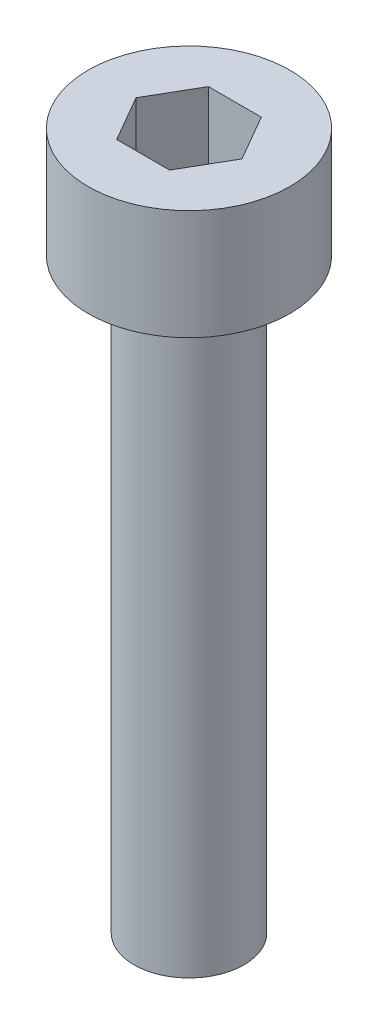
ISO-10303-21;
HEADER;
FILE_DESCRIPTION(('STEP AP214'),'2;1');
FILE_NAME('part.step','',(''),(''),'','','');
FILE_SCHEMA(('AUTOMOTIVE_DESIGN { 1 0 10303 214 1 1 1 1 }'));
ENDSEC;
DATA;
#1=APPLICATION_CONTEXT('core data for automotive mechanical design processes');
#2=APPLICATION_PROTOCOL_DEFINITION('international standard','automotive_design',2000,#1);
#3=PRODUCT_CONTEXT('',#1,'mechanical');
#4=PRODUCT('Part','Part','',(#3));
#5=PRODUCT_RELATED_PRODUCT_CATEGORY('part','',(#4));
#6=PRODUCT_DEFINITION_FORMATION('','',#4);
#7=PRODUCT_DEFINITION_CONTEXT('part definition',#1,'design');
#8=PRODUCT_DEFINITION('design','',#6,#7);
#9=PRODUCT_DEFINITION_SHAPE('','',#8);
#10=(LENGTH_UNIT() NAMED_UNIT(*) SI_UNIT(.MILLI.,.METRE.));
#11=(NAMED_UNIT(*) PLANE_ANGLE_UNIT() SI_UNIT($,.RADIAN.));
#12=(NAMED_UNIT(*) SI_UNIT($,.STERADIAN.) SOLID_ANGLE_UNIT());
#13=UNCERTAINTY_MEASURE_WITH_UNIT(LENGTH_MEASURE(1.E-05),#10,'distance_accuracy_value','');
#14=(GEOMETRIC_REPRESENTATION_CONTEXT(3) GLOBAL_UNCERTAINTY_ASSIGNED_CONTEXT((#13)) GLOBAL_UNIT_ASSIGNED_CONTEXT((#10,
#11,#12)) REPRESENTATION_CONTEXT('',''));
#15=CARTESIAN_POINT('',(0.,0.,0.));
#16=DIRECTION('',(0.,0.,1.));
#17=DIRECTION('',(1.,0.,0.));
#18=AXIS2_PLACEMENT_3D('',#15,#16,#17);
#19=CARTESIAN_POINT('',(0.,1.,0.));
#20=DIRECTION('',(0.,-1.,0.));
#21=DIRECTION('',(0.,0.,-1.));
#22=AXIS2_PLACEMENT_3D('',#19,#20,#21);
#23=PLANE('',#22);
#24=DIRECTION('',(0.50000000000019,0.,0.866025403784329));
#25=VECTOR('',#24,1.);
#26=CARTESIAN_POINT('',(0.7216875,1.,-1.249999417187));
#27=LINE('',#26,#25);
#28=CARTESIAN_POINT('',(0.7216875,1.,-1.249999417187));
#29=VERTEX_POINT('',#28);
#30=CARTESIAN_POINT('',(1.443375,1.,0.));
#31=VERTEX_POINT('',#30);
#32=EDGE_CURVE('E9',#29,#31,#27,.T.);
#33=ORIENTED_EDGE('',*,*,#32,.F.);
#34=DIRECTION('',(1.,0.,0.));
#35=VECTOR('',#34,1.);
#36=CARTESIAN_POINT('',(-0.7216875,1.,-1.249999417187));
#37=LINE('',#36,#35);
#38=CARTESIAN_POINT('',(-0.7216875,1.,-1.249999417187));
#39=VERTEX_POINT('',#38);
#40=EDGE_CURVE('E44',#39,#29,#37,.T.);
#41=ORIENTED_EDGE('',*,*,#40,.F.);
#42=DIRECTION('',(0.50000000000019,0.,-0.866025403784329));
#43=VECTOR('',#42,1.);
#44=CARTESIAN_POINT('',(-1.443375,1.,0.));
#45=LINE('',#44,#43);
#46=CARTESIAN_POINT('',(-1.443375,1.,0.));
#47=VERTEX_POINT('',#46);
#48=EDGE_CURVE('E125',#47,#39,#45,.T.);
#49=ORIENTED_EDGE('',*,*,#48,.F.);
#50=DIRECTION('',(-0.50000000000019,0.,-0.866025403784329));
#51=VECTOR('',#50,1.);
#52=CARTESIAN_POINT('',(-0.7216875,1.,1.249999417187));
#53=LINE('',#52,#51);
#54=CARTESIAN_POINT('',(-0.7216875,1.,1.249999417187));
#55=VERTEX_POINT('',#54);
#56=EDGE_CURVE('E88',#55,#47,#53,.T.);
#57=ORIENTED_EDGE('',*,*,#56,.F.);
#58=DIRECTION('',(-1.,0.,0.));
#59=VECTOR('',#58,1.);
#60=CARTESIAN_POINT('',(0.7216875,1.,1.249999417187));
#61=LINE('',#60,#59);
#62=CARTESIAN_POINT('',(0.7216875,1.,1.249999417187));
#63=VERTEX_POINT('',#62);
#64=EDGE_CURVE('E83',#63,#55,#61,.T.);
#65=ORIENTED_EDGE('',*,*,#64,.F.);
#66=DIRECTION('',(-0.50000000000019,0.,0.866025403784329));
#67=VECTOR('',#66,1.);
#68=CARTESIAN_POINT('',(1.443375,1.,0.));
#69=LINE('',#68,#67);
#70=EDGE_CURVE('E86',#31,#63,#69,.T.);
#71=ORIENTED_EDGE('',*,*,#70,.F.);
#72=EDGE_LOOP('',(#33,#41,#49,#57,#65,#71));
#73=FACE_BOUND('',#72,.T.);
#74=ADVANCED_FACE('F15',(#73),#23,.F.);
#75=CARTESIAN_POINT('',(0.,-16.,0.));
#76=DIRECTION('',(0.,-1.,0.));
#77=DIRECTION('',(0.,0.,-1.));
#78=AXIS2_PLACEMENT_3D('',#75,#76,#77);
#79=PLANE('',#78);
#80=CARTESIAN_POINT('',(0.,-16.,0.));
#81=DIRECTION('',(0.,-1.,0.));
#82=DIRECTION('',(1.,0.,0.));
#83=AXIS2_PLACEMENT_3D('',#80,#81,#82);
#84=CIRCLE('',#83,1.5);
#85=CARTESIAN_POINT('',(1.5,-16.,0.));
#86=VERTEX_POINT('',#85);
#87=EDGE_CURVE('E109',#86,#86,#84,.T.);
#88=ORIENTED_EDGE('',*,*,#87,.T.);
#89=EDGE_LOOP('',(#88));
#90=FACE_BOUND('',#89,.T.);
#91=ADVANCED_FACE('F232',(#90),#79,.T.);
#92=CARTESIAN_POINT('',(0.7216875,1.,-1.249999417187));
#93=DIRECTION('',(0.866025403784329,0.,-0.50000000000019));
#94=DIRECTION('',(0.,-1.,0.));
#95=AXIS2_PLACEMENT_3D('',#92,#93,#94);
#96=PLANE('',#95);
#97=ORIENTED_EDGE('',*,*,#32,.T.);
#98=DIRECTION('',(0.,1.,0.));
#99=VECTOR('',#98,1.);
#100=CARTESIAN_POINT('',(1.443375,1.,0.));
#101=LINE('',#100,#99);
#102=CARTESIAN_POINT('',(1.443375,3.,0.));
#103=VERTEX_POINT('',#102);
#104=EDGE_CURVE('E94',#31,#103,#101,.T.);
#105=ORIENTED_EDGE('',*,*,#104,.T.);
#106=DIRECTION('',(0.50000000000019,0.,0.866025403784329));
#107=VECTOR('',#106,1.);
#108=CARTESIAN_POINT('',(0.7216875,3.,-1.249999417187));
#109=LINE('',#108,#107);
#110=CARTESIAN_POINT('',(0.7216875,3.,-1.249999417187));
#111=VERTEX_POINT('',#110);
#112=EDGE_CURVE('E144',#111,#103,#109,.T.);
#113=ORIENTED_EDGE('',*,*,#112,.F.);
#114=DIRECTION('',(0.,1.,0.));
#115=VECTOR('',#114,1.);
#116=CARTESIAN_POINT('',(0.7216875,1.,-1.249999417187));
#117=LINE('',#116,#115);
#118=EDGE_CURVE('E24',#29,#111,#117,.T.);
#119=ORIENTED_EDGE('',*,*,#118,.F.);
#120=EDGE_LOOP('',(#97,#105,#113,#119));
#121=FACE_BOUND('',#120,.T.);
#122=ADVANCED_FACE('F17',(#121),#96,.F.);
#123=CARTESIAN_POINT('',(-0.7216875,1.,-1.249999417187));
#124=DIRECTION('',(0.,0.,-1.));
#125=DIRECTION('',(-1.,0.,0.));
#126=AXIS2_PLACEMENT_3D('',#123,#124,#125);
#127=PLANE('',#126);
#128=ORIENTED_EDGE('',*,*,#40,.T.);
#129=ORIENTED_EDGE('',*,*,#118,.T.);
#130=DIRECTION('',(1.,0.,0.));
#131=VECTOR('',#130,1.);
#132=CARTESIAN_POINT('',(-0.7216875,3.,-1.249999417187));
#133=LINE('',#132,#131);
#134=CARTESIAN_POINT('',(-0.7216875,3.,-1.249999417187));
#135=VERTEX_POINT('',#134);
#136=EDGE_CURVE('E140',#135,#111,#133,.T.);
#137=ORIENTED_EDGE('',*,*,#136,.F.);
#138=DIRECTION('',(0.,1.,0.));
#139=VECTOR('',#138,1.);
#140=CARTESIAN_POINT('',(-0.7216875,1.,-1.249999417187));
#141=LINE('',#140,#139);
#142=EDGE_CURVE('E129',#39,#135,#141,.T.);
#143=ORIENTED_EDGE('',*,*,#142,.F.);
#144=EDGE_LOOP('',(#128,#129,#137,#143));
#145=FACE_BOUND('',#144,.T.);
#146=ADVANCED_FACE('F138',(#145),#127,.F.);
#147=CARTESIAN_POINT('',(-1.443375,1.,0.));
#148=DIRECTION('',(-0.866025403784329,0.,-0.50000000000019));
#149=DIRECTION('',(-0.50000000000019,0.,0.866025403784329));
#150=AXIS2_PLACEMENT_3D('',#147,#148,#149);
#151=PLANE('',#150);
#152=ORIENTED_EDGE('',*,*,#48,.T.);
#153=ORIENTED_EDGE('',*,*,#142,.T.);
#154=DIRECTION('',(0.50000000000019,0.,-0.866025403784329));
#155=VECTOR('',#154,1.);
#156=CARTESIAN_POINT('',(-1.443375,3.,0.));
#157=LINE('',#156,#155);
#158=CARTESIAN_POINT('',(-1.443375,3.,0.));
#159=VERTEX_POINT('',#158);
#160=EDGE_CURVE('E153',#159,#135,#157,.T.);
#161=ORIENTED_EDGE('',*,*,#160,.F.);
#162=DIRECTION('',(0.,1.,0.));
#163=VECTOR('',#162,1.);
#164=CARTESIAN_POINT('',(-1.443375,1.,0.));
#165=LINE('',#164,#163);
#166=EDGE_CURVE('E121',#47,#159,#165,.T.);
#167=ORIENTED_EDGE('',*,*,#166,.F.);
#168=EDGE_LOOP('',(#152,#153,#161,#167));
#169=FACE_BOUND('',#168,.T.);
#170=ADVANCED_FACE('F245',(#169),#151,.F.);
#171=CARTESIAN_POINT('',(-0.7216875,1.,1.249999417187));
#172=DIRECTION('',(-0.866025403784329,0.,0.50000000000019));
#173=DIRECTION('',(0.,1.,0.));
#174=AXIS2_PLACEMENT_3D('',#171,#172,#173);
#175=PLANE('',#174);
#176=ORIENTED_EDGE('',*,*,#56,.T.);
#177=ORIENTED_EDGE('',*,*,#166,.T.);
#178=DIRECTION('',(-0.50000000000019,0.,-0.866025403784329));
#179=VECTOR('',#178,1.);
#180=CARTESIAN_POINT('',(-0.7216875,3.,1.249999417187));
#181=LINE('',#180,#179);
#182=CARTESIAN_POINT('',(-0.7216875,3.,1.249999417187));
#183=VERTEX_POINT('',#182);
#184=EDGE_CURVE('E160',#183,#159,#181,.T.);
#185=ORIENTED_EDGE('',*,*,#184,.F.);
#186=DIRECTION('',(0.,1.,0.));
#187=VECTOR('',#186,1.);
#188=CARTESIAN_POINT('',(-0.7216875,1.,1.249999417187));
#189=LINE('',#188,#187);
#190=EDGE_CURVE('E93',#55,#183,#189,.T.);
#191=ORIENTED_EDGE('',*,*,#190,.F.);
#192=EDGE_LOOP('',(#176,#177,#185,#191));
#193=FACE_BOUND('',#192,.T.);
#194=ADVANCED_FACE('F201',(#193),#175,.F.);
#195=CARTESIAN_POINT('',(0.7216875,1.,1.249999417187));
#196=DIRECTION('',(0.,0.,1.));
#197=DIRECTION('',(1.,0.,0.));
#198=AXIS2_PLACEMENT_3D('',#195,#196,#197);
#199=PLANE('',#198);
#200=ORIENTED_EDGE('',*,*,#64,.T.);
#201=ORIENTED_EDGE('',*,*,#190,.T.);
#202=DIRECTION('',(-1.,0.,0.));
#203=VECTOR('',#202,1.);
#204=CARTESIAN_POINT('',(0.7216875,3.,1.249999417187));
#205=LINE('',#204,#203);
#206=CARTESIAN_POINT('',(0.7216875,3.,1.249999417187));
#207=VERTEX_POINT('',#206);
#208=EDGE_CURVE('E100',#207,#183,#205,.T.);
#209=ORIENTED_EDGE('',*,*,#208,.F.);
#210=DIRECTION('',(0.,1.,0.));
#211=VECTOR('',#210,1.);
#212=CARTESIAN_POINT('',(0.7216875,1.,1.249999417187));
#213=LINE('',#212,#211);
#214=EDGE_CURVE('E97',#63,#207,#213,.T.);
#215=ORIENTED_EDGE('',*,*,#214,.F.);
#216=EDGE_LOOP('',(#200,#201,#209,#215));
#217=FACE_BOUND('',#216,.T.);
#218=ADVANCED_FACE('F98',(#217),#199,.F.);
#219=CARTESIAN_POINT('',(1.443375,1.,0.));
#220=DIRECTION('',(0.866025403784329,0.,0.50000000000019));
#221=DIRECTION('',(0.,-1.,0.));
#222=AXIS2_PLACEMENT_3D('',#219,#220,#221);
#223=PLANE('',#222);
#224=ORIENTED_EDGE('',*,*,#70,.T.);
#225=ORIENTED_EDGE('',*,*,#214,.T.);
#226=DIRECTION('',(-0.50000000000019,0.,0.866025403784329));
#227=VECTOR('',#226,1.);
#228=CARTESIAN_POINT('',(1.443375,3.,0.));
#229=LINE('',#228,#227);
#230=EDGE_CURVE('E147',#103,#207,#229,.T.);
#231=ORIENTED_EDGE('',*,*,#230,.F.);
#232=ORIENTED_EDGE('',*,*,#104,.F.);
#233=EDGE_LOOP('',(#224,#225,#231,#232));
#234=FACE_BOUND('',#233,.T.);
#235=ADVANCED_FACE('F107',(#234),#223,.F.);
#236=CARTESIAN_POINT('',(0.,0.,0.));
#237=DIRECTION('',(0.,1.,0.));
#238=DIRECTION('',(1.,0.,0.));
#239=AXIS2_PLACEMENT_3D('',#236,#237,#238);
#240=CYLINDRICAL_SURFACE('',#239,1.5);
#241=CARTESIAN_POINT('',(0.,0.,0.));
#242=DIRECTION('',(0.,-1.,0.));
#243=DIRECTION('',(1.,0.,0.));
#244=AXIS2_PLACEMENT_3D('',#241,#242,#243);
#245=CIRCLE('',#244,1.5);
#246=CARTESIAN_POINT('',(1.5,0.,0.));
#247=VERTEX_POINT('',#246);
#248=EDGE_CURVE('E191',#247,#247,#245,.T.);
#249=ORIENTED_EDGE('',*,*,#248,.T.);
#250=DIRECTION('',(0.,-1.,0.));
#251=VECTOR('',#250,1.);
#252=CARTESIAN_POINT('',(1.5,0.,0.));
#253=LINE('',#252,#251);
#254=EDGE_CURVE('E113',#247,#86,#253,.T.);
#255=ORIENTED_EDGE('',*,*,#254,.T.);
#256=ORIENTED_EDGE('',*,*,#87,.F.);
#257=ORIENTED_EDGE('',*,*,#254,.F.);
#258=EDGE_LOOP('',(#249,#255,#256,#257));
#259=FACE_BOUND('',#258,.T.);
#260=ADVANCED_FACE('F221',(#259),#240,.T.);
#261=CARTESIAN_POINT('',(0.,3.,0.));
#262=DIRECTION('',(0.,-1.,0.));
#263=DIRECTION('',(0.,0.,-1.));
#264=AXIS2_PLACEMENT_3D('',#261,#262,#263);
#265=PLANE('',#264);
#266=ORIENTED_EDGE('',*,*,#208,.T.);
#267=ORIENTED_EDGE('',*,*,#184,.T.);
#268=ORIENTED_EDGE('',*,*,#160,.T.);
#269=ORIENTED_EDGE('',*,*,#136,.T.);
#270=ORIENTED_EDGE('',*,*,#112,.T.);
#271=ORIENTED_EDGE('',*,*,#230,.T.);
#272=EDGE_LOOP('',(#266,#267,#268,#269,#270,#271));
#273=FACE_BOUND('',#272,.T.);
#274=CARTESIAN_POINT('',(0.,3.,0.));
#275=DIRECTION('',(0.,-1.,0.));
#276=DIRECTION('',(1.,0.,0.));
#277=AXIS2_PLACEMENT_3D('',#274,#275,#276);
#278=CIRCLE('',#277,2.75);
#279=CARTESIAN_POINT('',(2.75,3.,0.));
#280=VERTEX_POINT('',#279);
#281=EDGE_CURVE('E183',#280,#280,#278,.T.);
#282=ORIENTED_EDGE('',*,*,#281,.F.);
#283=EDGE_LOOP('',(#282));
#284=FACE_BOUND('',#283,.T.);
#285=ADVANCED_FACE('F149',(#273,#284),#265,.F.);
#286=CARTESIAN_POINT('',(0.,0.,0.));
#287=DIRECTION('',(0.,-1.,0.));
#288=DIRECTION('',(0.,0.,-1.));
#289=AXIS2_PLACEMENT_3D('',#286,#287,#288);
#290=PLANE('',#289);
#291=ORIENTED_EDGE('',*,*,#248,.F.);
#292=EDGE_LOOP('',(#291));
#293=FACE_BOUND('',#292,.T.);
#294=CARTESIAN_POINT('',(0.,0.,0.));
#295=DIRECTION('',(0.,-1.,0.));
#296=DIRECTION('',(1.,0.,0.));
#297=AXIS2_PLACEMENT_3D('',#294,#295,#296);
#298=CIRCLE('',#297,2.75);
#299=CARTESIAN_POINT('',(2.75,0.,0.));
#300=VERTEX_POINT('',#299);
#301=EDGE_CURVE('E186',#300,#300,#298,.T.);
#302=ORIENTED_EDGE('',*,*,#301,.T.);
#303=EDGE_LOOP('',(#302));
#304=FACE_BOUND('',#303,.T.);
#305=ADVANCED_FACE('F215',(#293,#304),#290,.T.);
#306=CARTESIAN_POINT('',(0.,0.,0.));
#307=DIRECTION('',(0.,-1.,0.));
#308=DIRECTION('',(1.,0.,0.));
#309=AXIS2_PLACEMENT_3D('',#306,#307,#308);
#310=CYLINDRICAL_SURFACE('',#309,2.75);
#311=DIRECTION('',(0.,1.,0.));
#312=VECTOR('',#311,1.);
#313=CARTESIAN_POINT('',(2.75,0.,0.));
#314=LINE('',#313,#312);
#315=EDGE_CURVE('E180',#300,#280,#314,.T.);
#316=ORIENTED_EDGE('',*,*,#315,.T.);
#317=ORIENTED_EDGE('',*,*,#281,.T.);
#318=ORIENTED_EDGE('',*,*,#315,.F.);
#319=ORIENTED_EDGE('',*,*,#301,.F.);
#320=EDGE_LOOP('',(#316,#317,#318,#319));
#321=FACE_BOUND('',#320,.T.);
#322=ADVANCED_FACE('F218',(#321),#310,.T.);
#323=CLOSED_SHELL('',(#74,#91,#122,#146,#170,#194,#218,#235,#260,#285,#305,#322));
#324=MANIFOLD_SOLID_BREP('B1',#323);
#325=ADVANCED_BREP_SHAPE_REPRESENTATION('',(#18,#324),#14);
#326=SHAPE_DEFINITION_REPRESENTATION(#9,#325);
ENDSEC;
END-ISO-10303-21;
